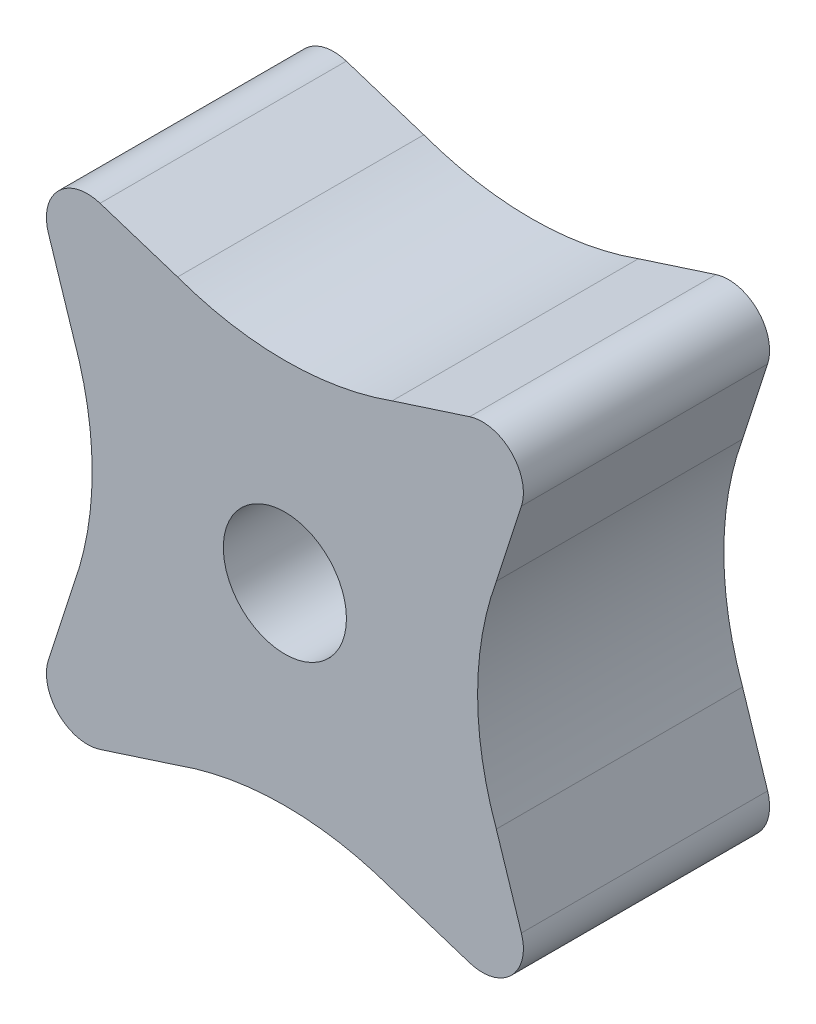
ISO-10303-21;
HEADER;
FILE_DESCRIPTION(('STEP AP214'),'2;1');
FILE_NAME('part.step','',(''),(''),'','','');
FILE_SCHEMA(('AUTOMOTIVE_DESIGN { 1 0 10303 214 1 1 1 1 }'));
ENDSEC;
DATA;
#1=APPLICATION_CONTEXT('core data for automotive mechanical design processes');
#2=APPLICATION_PROTOCOL_DEFINITION('international standard','automotive_design',2000,#1);
#3=PRODUCT_CONTEXT('',#1,'mechanical');
#4=PRODUCT('Part','Part','',(#3));
#5=PRODUCT_RELATED_PRODUCT_CATEGORY('part','',(#4));
#6=PRODUCT_DEFINITION_FORMATION('','',#4);
#7=PRODUCT_DEFINITION_CONTEXT('part definition',#1,'design');
#8=PRODUCT_DEFINITION('design','',#6,#7);
#9=PRODUCT_DEFINITION_SHAPE('','',#8);
#10=(LENGTH_UNIT() NAMED_UNIT(*) SI_UNIT(.MILLI.,.METRE.));
#11=(NAMED_UNIT(*) PLANE_ANGLE_UNIT() SI_UNIT($,.RADIAN.));
#12=(NAMED_UNIT(*) SI_UNIT($,.STERADIAN.) SOLID_ANGLE_UNIT());
#13=UNCERTAINTY_MEASURE_WITH_UNIT(LENGTH_MEASURE(1.E-05),#10,'distance_accuracy_value','');
#14=(GEOMETRIC_REPRESENTATION_CONTEXT(3) GLOBAL_UNCERTAINTY_ASSIGNED_CONTEXT((#13)) GLOBAL_UNIT_ASSIGNED_CONTEXT((#10,
#11,#12)) REPRESENTATION_CONTEXT('',''));
#15=CARTESIAN_POINT('',(0.,0.,0.));
#16=DIRECTION('',(0.,0.,1.));
#17=DIRECTION('',(1.,0.,0.));
#18=AXIS2_PLACEMENT_3D('',#15,#16,#17);
#19=CARTESIAN_POINT('',(-4.81138082412624,4.81138082412436,6.));
#20=DIRECTION('',(0.,0.,-1.));
#21=DIRECTION('',(-1.,0.,0.));
#22=AXIS2_PLACEMENT_3D('',#19,#20,#21);
#23=PLANE('',#22);
#24=CARTESIAN_POINT('',(-4.81138082412624,4.81138082412436,6.));
#25=DIRECTION('',(0.,0.,1.));
#26=DIRECTION('',(-1.,0.,0.));
#27=AXIS2_PLACEMENT_3D('',#24,#25,#26);
#28=CIRCLE('',#27,0.999999999999999);
#29=CARTESIAN_POINT('',(-4.50391183145184,5.76293892458054,6.));
#30=VERTEX_POINT('',#29);
#31=CARTESIAN_POINT('',(-5.7629389245828,4.50391183145111,6.));
#32=VERTEX_POINT('',#31);
#33=EDGE_CURVE('E208',#30,#32,#28,.T.);
#34=ORIENTED_EDGE('',*,*,#33,.T.);
#35=DIRECTION('',(0.307468992673234,-0.951558100456565,0.));
#36=VECTOR('',#35,1.);
#37=CARTESIAN_POINT('',(-5.15257063979893,2.61493798534649,6.));
#38=LINE('',#37,#36);
#39=CARTESIAN_POINT('',(-5.1525706397989,2.6149379853465,6.));
#40=VERTEX_POINT('',#39);
#41=EDGE_CURVE('E116',#32,#40,#38,.T.);
#42=ORIENTED_EDGE('',*,*,#41,.T.);
#43=CARTESIAN_POINT('',(-12.4148955874068,-6.95131414664462E-12,6.));
#44=DIRECTION('',(0.,0.,-1.));
#45=DIRECTION('',(1.,0.,0.));
#46=AXIS2_PLACEMENT_3D('',#43,#44,#45);
#47=CIRCLE('',#46,7.71876054246353);
#48=CARTESIAN_POINT('',(-5.15257063979467,-2.61493798534874,6.));
#49=VERTEX_POINT('',#48);
#50=EDGE_CURVE('E247',#40,#49,#47,.T.);
#51=ORIENTED_EDGE('',*,*,#50,.T.);
#52=DIRECTION('',(-0.307468992674399,-0.951558100456189,0.));
#53=VECTOR('',#52,1.);
#54=CARTESIAN_POINT('',(-5.76293892458059,-4.50391183145178,6.));
#55=LINE('',#54,#53);
#56=CARTESIAN_POINT('',(-5.76293892458059,-4.50391183145178,6.));
#57=VERTEX_POINT('',#56);
#58=EDGE_CURVE('E266',#49,#57,#55,.T.);
#59=ORIENTED_EDGE('',*,*,#58,.T.);
#60=CARTESIAN_POINT('',(-4.81138082412441,-4.81138082412619,6.));
#61=DIRECTION('',(0.,0.,1.));
#62=DIRECTION('',(-1.,0.,0.));
#63=AXIS2_PLACEMENT_3D('',#60,#61,#62);
#64=CIRCLE('',#63,0.999999999999999);
#65=CARTESIAN_POINT('',(-4.50391183145117,-5.76293892458276,6.));
#66=VERTEX_POINT('',#65);
#67=EDGE_CURVE('E263',#57,#66,#64,.T.);
#68=ORIENTED_EDGE('',*,*,#67,.T.);
#69=DIRECTION('',(0.951558100456568,0.307468992673224,0.));
#70=VECTOR('',#69,1.);
#71=CARTESIAN_POINT('',(-2.61493798534654,-5.1525706397989,6.));
#72=LINE('',#71,#70);
#73=CARTESIAN_POINT('',(-2.61493798534654,-5.1525706397989,6.));
#74=VERTEX_POINT('',#73);
#75=EDGE_CURVE('E265',#66,#74,#72,.T.);
#76=ORIENTED_EDGE('',*,*,#75,.T.);
#77=CARTESIAN_POINT('',(6.99379316117375E-12,-12.4148955874068,6.));
#78=DIRECTION('',(0.,0.,-1.));
#79=DIRECTION('',(1.,0.,0.));
#80=AXIS2_PLACEMENT_3D('',#77,#78,#79);
#81=CIRCLE('',#80,7.71876054246356);
#82=CARTESIAN_POINT('',(2.61493798534876,-5.15257063979467,6.));
#83=VERTEX_POINT('',#82);
#84=EDGE_CURVE('E268',#74,#83,#81,.T.);
#85=ORIENTED_EDGE('',*,*,#84,.T.);
#86=DIRECTION('',(0.95155810045619,-0.307468992674396,0.));
#87=VECTOR('',#86,1.);
#88=CARTESIAN_POINT('',(4.50391183145179,-5.76293892458057,6.));
#89=LINE('',#88,#87);
#90=CARTESIAN_POINT('',(4.5039118314518,-5.76293892458057,6.));
#91=VERTEX_POINT('',#90);
#92=EDGE_CURVE('E274',#83,#91,#89,.T.);
#93=ORIENTED_EDGE('',*,*,#92,.T.);
#94=CARTESIAN_POINT('',(4.81138082412621,-4.81138082412439,6.));
#95=DIRECTION('',(0.,0.,1.));
#96=DIRECTION('',(-1.,0.,0.));
#97=AXIS2_PLACEMENT_3D('',#94,#95,#96);
#98=CIRCLE('',#97,0.999999999999999);
#99=CARTESIAN_POINT('',(5.76293892458277,-4.50391183145115,6.));
#100=VERTEX_POINT('',#99);
#101=EDGE_CURVE('E276',#91,#100,#98,.T.);
#102=ORIENTED_EDGE('',*,*,#101,.T.);
#103=DIRECTION('',(-0.307468992673227,0.951558100456567,0.));
#104=VECTOR('',#103,1.);
#105=CARTESIAN_POINT('',(5.15257063979891,-2.61493798534652,6.));
#106=LINE('',#105,#104);
#107=CARTESIAN_POINT('',(5.15257063979891,-2.61493798534652,6.));
#108=VERTEX_POINT('',#107);
#109=EDGE_CURVE('E278',#100,#108,#106,.T.);
#110=ORIENTED_EDGE('',*,*,#109,.T.);
#111=CARTESIAN_POINT('',(12.4148955874068,7.03800689917885E-12,6.));
#112=DIRECTION('',(0.,0.,-1.));
#113=DIRECTION('',(1.,0.,0.));
#114=AXIS2_PLACEMENT_3D('',#111,#112,#113);
#115=CIRCLE('',#114,7.71876054246356);
#116=CARTESIAN_POINT('',(5.15257063979466,2.61493798534878,6.));
#117=VERTEX_POINT('',#116);
#118=EDGE_CURVE('E280',#108,#117,#115,.T.);
#119=ORIENTED_EDGE('',*,*,#118,.T.);
#120=DIRECTION('',(0.307468992674393,0.951558100456191,0.));
#121=VECTOR('',#120,1.);
#122=CARTESIAN_POINT('',(5.76293892458056,4.50391183145182,6.));
#123=LINE('',#122,#121);
#124=CARTESIAN_POINT('',(5.76293892458056,4.50391183145182,6.));
#125=VERTEX_POINT('',#124);
#126=EDGE_CURVE('E282',#117,#125,#123,.T.);
#127=ORIENTED_EDGE('',*,*,#126,.T.);
#128=CARTESIAN_POINT('',(4.81138082412437,4.81138082412623,6.));
#129=DIRECTION('',(0.,0.,1.));
#130=DIRECTION('',(-1.,0.,0.));
#131=AXIS2_PLACEMENT_3D('',#128,#129,#130);
#132=CIRCLE('',#131,0.999999999999999);
#133=CARTESIAN_POINT('',(4.50391183145113,5.76293892458279,6.));
#134=VERTEX_POINT('',#133);
#135=EDGE_CURVE('E159',#125,#134,#132,.T.);
#136=ORIENTED_EDGE('',*,*,#135,.T.);
#137=DIRECTION('',(-0.951558100456566,-0.307468992673231,0.));
#138=VECTOR('',#137,1.);
#139=CARTESIAN_POINT('',(2.6149379853465,5.15257063979892,6.));
#140=LINE('',#139,#138);
#141=CARTESIAN_POINT('',(2.6149379853465,5.15257063979892,6.));
#142=VERTEX_POINT('',#141);
#143=EDGE_CURVE('E153',#134,#142,#140,.T.);
#144=ORIENTED_EDGE('',*,*,#143,.T.);
#145=CARTESIAN_POINT('',(-7.08135327544597E-12,12.4148955874068,6.));
#146=DIRECTION('',(0.,0.,-1.));
#147=DIRECTION('',(1.,0.,0.));
#148=AXIS2_PLACEMENT_3D('',#145,#146,#147);
#149=CIRCLE('',#148,7.71876054246356);
#150=CARTESIAN_POINT('',(-2.6149379853488,5.15257063979465,6.));
#151=VERTEX_POINT('',#150);
#152=EDGE_CURVE('E157',#142,#151,#149,.T.);
#153=ORIENTED_EDGE('',*,*,#152,.T.);
#154=DIRECTION('',(-0.951558100456192,0.30746899267439,0.));
#155=VECTOR('',#154,1.);
#156=CARTESIAN_POINT('',(-4.50391183145184,5.76293892458054,6.));
#157=LINE('',#156,#155);
#158=EDGE_CURVE('E49',#151,#30,#157,.T.);
#159=ORIENTED_EDGE('',*,*,#158,.T.);
#160=EDGE_LOOP('',(#34,#42,#51,#59,#68,#76,#85,#93,#102,#110,#119,#127,#136,#144,#153,#159));
#161=FACE_BOUND('',#160,.T.);
#162=CARTESIAN_POINT('',(0.,0.,6.));
#163=DIRECTION('',(0.,0.,1.));
#164=DIRECTION('',(1.,0.,0.));
#165=AXIS2_PLACEMENT_3D('',#162,#163,#164);
#166=CIRCLE('',#165,1.5);
#167=CARTESIAN_POINT('',(1.5,0.,6.));
#168=VERTEX_POINT('',#167);
#169=EDGE_CURVE('E181',#168,#168,#166,.T.);
#170=ORIENTED_EDGE('',*,*,#169,.F.);
#171=EDGE_LOOP('',(#170));
#172=FACE_BOUND('',#171,.T.);
#173=ADVANCED_FACE('F32',(#161,#172),#23,.F.);
#174=CARTESIAN_POINT('',(-4.81138082412624,4.81138082412436,0.));
#175=DIRECTION('',(0.,0.,-1.));
#176=DIRECTION('',(-1.,0.,0.));
#177=AXIS2_PLACEMENT_3D('',#174,#175,#176);
#178=PLANE('',#177);
#179=CARTESIAN_POINT('',(-4.81138082412624,4.81138082412436,0.));
#180=DIRECTION('',(0.,0.,1.));
#181=DIRECTION('',(-1.,0.,0.));
#182=AXIS2_PLACEMENT_3D('',#179,#180,#181);
#183=CIRCLE('',#182,0.999999999999999);
#184=CARTESIAN_POINT('',(-4.50391183145184,5.76293892458054,0.));
#185=VERTEX_POINT('',#184);
#186=CARTESIAN_POINT('',(-5.7629389245828,4.50391183145111,0.));
#187=VERTEX_POINT('',#186);
#188=EDGE_CURVE('E177',#185,#187,#183,.T.);
#189=ORIENTED_EDGE('',*,*,#188,.F.);
#190=DIRECTION('',(-0.951558100456192,0.30746899267439,0.));
#191=VECTOR('',#190,1.);
#192=CARTESIAN_POINT('',(-4.50391183145184,5.76293892458054,0.));
#193=LINE('',#192,#191);
#194=CARTESIAN_POINT('',(-2.6149379853488,5.15257063979465,0.));
#195=VERTEX_POINT('',#194);
#196=EDGE_CURVE('E108',#195,#185,#193,.T.);
#197=ORIENTED_EDGE('',*,*,#196,.F.);
#198=CARTESIAN_POINT('',(-7.08135327544597E-12,12.4148955874068,0.));
#199=DIRECTION('',(0.,0.,-1.));
#200=DIRECTION('',(1.,0.,0.));
#201=AXIS2_PLACEMENT_3D('',#198,#199,#200);
#202=CIRCLE('',#201,7.71876054246356);
#203=CARTESIAN_POINT('',(2.6149379853465,5.15257063979892,0.));
#204=VERTEX_POINT('',#203);
#205=EDGE_CURVE('E102',#204,#195,#202,.T.);
#206=ORIENTED_EDGE('',*,*,#205,.F.);
#207=DIRECTION('',(-0.951558100456566,-0.307468992673231,0.));
#208=VECTOR('',#207,1.);
#209=CARTESIAN_POINT('',(2.6149379853465,5.15257063979892,0.));
#210=LINE('',#209,#208);
#211=CARTESIAN_POINT('',(4.50391183145113,5.76293892458279,0.));
#212=VERTEX_POINT('',#211);
#213=EDGE_CURVE('E167',#212,#204,#210,.T.);
#214=ORIENTED_EDGE('',*,*,#213,.F.);
#215=CARTESIAN_POINT('',(4.81138082412437,4.81138082412623,0.));
#216=DIRECTION('',(0.,0.,1.));
#217=DIRECTION('',(-1.,0.,0.));
#218=AXIS2_PLACEMENT_3D('',#215,#216,#217);
#219=CIRCLE('',#218,0.999999999999999);
#220=CARTESIAN_POINT('',(5.76293892458056,4.50391183145182,0.));
#221=VERTEX_POINT('',#220);
#222=EDGE_CURVE('E203',#221,#212,#219,.T.);
#223=ORIENTED_EDGE('',*,*,#222,.F.);
#224=DIRECTION('',(0.307468992674393,0.951558100456191,0.));
#225=VECTOR('',#224,1.);
#226=CARTESIAN_POINT('',(5.76293892458056,4.50391183145182,0.));
#227=LINE('',#226,#225);
#228=CARTESIAN_POINT('',(5.15257063979466,2.61493798534878,0.));
#229=VERTEX_POINT('',#228);
#230=EDGE_CURVE('E201',#229,#221,#227,.T.);
#231=ORIENTED_EDGE('',*,*,#230,.F.);
#232=CARTESIAN_POINT('',(12.4148955874068,7.03800689917885E-12,0.));
#233=DIRECTION('',(0.,0.,-1.));
#234=DIRECTION('',(1.,0.,0.));
#235=AXIS2_PLACEMENT_3D('',#232,#233,#234);
#236=CIRCLE('',#235,7.71876054246356);
#237=CARTESIAN_POINT('',(5.15257063979891,-2.61493798534652,0.));
#238=VERTEX_POINT('',#237);
#239=EDGE_CURVE('E199',#238,#229,#236,.T.);
#240=ORIENTED_EDGE('',*,*,#239,.F.);
#241=DIRECTION('',(-0.307468992673227,0.951558100456567,0.));
#242=VECTOR('',#241,1.);
#243=CARTESIAN_POINT('',(5.15257063979891,-2.61493798534652,0.));
#244=LINE('',#243,#242);
#245=CARTESIAN_POINT('',(5.76293892458277,-4.50391183145115,0.));
#246=VERTEX_POINT('',#245);
#247=EDGE_CURVE('E197',#246,#238,#244,.T.);
#248=ORIENTED_EDGE('',*,*,#247,.F.);
#249=CARTESIAN_POINT('',(4.81138082412621,-4.81138082412439,0.));
#250=DIRECTION('',(0.,0.,1.));
#251=DIRECTION('',(-1.,0.,0.));
#252=AXIS2_PLACEMENT_3D('',#249,#250,#251);
#253=CIRCLE('',#252,0.999999999999999);
#254=CARTESIAN_POINT('',(4.5039118314518,-5.76293892458057,0.));
#255=VERTEX_POINT('',#254);
#256=EDGE_CURVE('E195',#255,#246,#253,.T.);
#257=ORIENTED_EDGE('',*,*,#256,.F.);
#258=DIRECTION('',(0.95155810045619,-0.307468992674396,0.));
#259=VECTOR('',#258,1.);
#260=CARTESIAN_POINT('',(4.50391183145179,-5.76293892458057,0.));
#261=LINE('',#260,#259);
#262=CARTESIAN_POINT('',(2.61493798534876,-5.15257063979467,0.));
#263=VERTEX_POINT('',#262);
#264=EDGE_CURVE('E193',#263,#255,#261,.T.);
#265=ORIENTED_EDGE('',*,*,#264,.F.);
#266=CARTESIAN_POINT('',(6.99379316117375E-12,-12.4148955874068,0.));
#267=DIRECTION('',(0.,0.,-1.));
#268=DIRECTION('',(1.,0.,0.));
#269=AXIS2_PLACEMENT_3D('',#266,#267,#268);
#270=CIRCLE('',#269,7.71876054246356);
#271=CARTESIAN_POINT('',(-2.61493798534654,-5.1525706397989,0.));
#272=VERTEX_POINT('',#271);
#273=EDGE_CURVE('E191',#272,#263,#270,.T.);
#274=ORIENTED_EDGE('',*,*,#273,.F.);
#275=DIRECTION('',(0.951558100456568,0.307468992673224,0.));
#276=VECTOR('',#275,1.);
#277=CARTESIAN_POINT('',(-2.61493798534654,-5.1525706397989,0.));
#278=LINE('',#277,#276);
#279=CARTESIAN_POINT('',(-4.50391183145117,-5.76293892458276,0.));
#280=VERTEX_POINT('',#279);
#281=EDGE_CURVE('E189',#280,#272,#278,.T.);
#282=ORIENTED_EDGE('',*,*,#281,.F.);
#283=CARTESIAN_POINT('',(-4.81138082412441,-4.81138082412619,0.));
#284=DIRECTION('',(0.,0.,1.));
#285=DIRECTION('',(-1.,0.,0.));
#286=AXIS2_PLACEMENT_3D('',#283,#284,#285);
#287=CIRCLE('',#286,0.999999999999999);
#288=CARTESIAN_POINT('',(-5.76293892458059,-4.50391183145178,0.));
#289=VERTEX_POINT('',#288);
#290=EDGE_CURVE('E187',#289,#280,#287,.T.);
#291=ORIENTED_EDGE('',*,*,#290,.F.);
#292=DIRECTION('',(-0.307468992674399,-0.951558100456189,0.));
#293=VECTOR('',#292,1.);
#294=CARTESIAN_POINT('',(-5.76293892458059,-4.50391183145178,0.));
#295=LINE('',#294,#293);
#296=CARTESIAN_POINT('',(-5.15257063979467,-2.61493798534874,0.));
#297=VERTEX_POINT('',#296);
#298=EDGE_CURVE('E185',#297,#289,#295,.T.);
#299=ORIENTED_EDGE('',*,*,#298,.F.);
#300=CARTESIAN_POINT('',(-12.4148955874068,-6.95131414664462E-12,0.));
#301=DIRECTION('',(0.,0.,-1.));
#302=DIRECTION('',(1.,0.,0.));
#303=AXIS2_PLACEMENT_3D('',#300,#301,#302);
#304=CIRCLE('',#303,7.71876054246353);
#305=CARTESIAN_POINT('',(-5.1525706397989,2.6149379853465,0.));
#306=VERTEX_POINT('',#305);
#307=EDGE_CURVE('E183',#306,#297,#304,.T.);
#308=ORIENTED_EDGE('',*,*,#307,.F.);
#309=DIRECTION('',(0.307468992673234,-0.951558100456565,0.));
#310=VECTOR('',#309,1.);
#311=CARTESIAN_POINT('',(-5.15257063979893,2.61493798534649,0.));
#312=LINE('',#311,#310);
#313=EDGE_CURVE('E180',#187,#306,#312,.T.);
#314=ORIENTED_EDGE('',*,*,#313,.F.);
#315=EDGE_LOOP('',(#189,#197,#206,#214,#223,#231,#240,#248,#257,#265,#274,#282,#291,#299,#308,#314));
#316=FACE_BOUND('',#315,.T.);
#317=CARTESIAN_POINT('',(0.,0.,0.));
#318=DIRECTION('',(0.,0.,1.));
#319=DIRECTION('',(1.,0.,0.));
#320=AXIS2_PLACEMENT_3D('',#317,#318,#319);
#321=CIRCLE('',#320,1.5);
#322=CARTESIAN_POINT('',(1.5,0.,0.));
#323=VERTEX_POINT('',#322);
#324=EDGE_CURVE('E481',#323,#323,#321,.T.);
#325=ORIENTED_EDGE('',*,*,#324,.T.);
#326=EDGE_LOOP('',(#325));
#327=FACE_BOUND('',#326,.T.);
#328=ADVANCED_FACE('F251',(#316,#327),#178,.T.);
#329=CARTESIAN_POINT('',(-4.81138082412624,4.81138082412436,6.));
#330=DIRECTION('',(0.,0.,-1.));
#331=DIRECTION('',(-1.,0.,0.));
#332=AXIS2_PLACEMENT_3D('',#329,#330,#331);
#333=CYLINDRICAL_SURFACE('',#332,0.999999999999999);
#334=ORIENTED_EDGE('',*,*,#188,.T.);
#335=DIRECTION('',(0.,0.,-1.));
#336=VECTOR('',#335,1.);
#337=CARTESIAN_POINT('',(-5.7629389245828,4.50391183145111,6.));
#338=LINE('',#337,#336);
#339=EDGE_CURVE('E11',#32,#187,#338,.T.);
#340=ORIENTED_EDGE('',*,*,#339,.F.);
#341=ORIENTED_EDGE('',*,*,#33,.F.);
#342=DIRECTION('',(0.,0.,-1.));
#343=VECTOR('',#342,1.);
#344=CARTESIAN_POINT('',(-4.50391183145184,5.76293892458054,6.));
#345=LINE('',#344,#343);
#346=EDGE_CURVE('E173',#30,#185,#345,.T.);
#347=ORIENTED_EDGE('',*,*,#346,.T.);
#348=EDGE_LOOP('',(#334,#340,#341,#347));
#349=FACE_BOUND('',#348,.T.);
#350=ADVANCED_FACE('F34',(#349),#333,.T.);
#351=CARTESIAN_POINT('',(-5.15257063979893,2.61493798534649,6.));
#352=DIRECTION('',(0.951558100456565,0.307468992673234,0.));
#353=DIRECTION('',(-0.307468992673234,0.951558100456565,0.));
#354=AXIS2_PLACEMENT_3D('',#351,#352,#353);
#355=PLANE('',#354);
#356=ORIENTED_EDGE('',*,*,#313,.T.);
#357=DIRECTION('',(0.,0.,-1.));
#358=VECTOR('',#357,1.);
#359=CARTESIAN_POINT('',(-5.1525706397989,2.6149379853465,6.));
#360=LINE('',#359,#358);
#361=EDGE_CURVE('E41',#40,#306,#360,.T.);
#362=ORIENTED_EDGE('',*,*,#361,.F.);
#363=ORIENTED_EDGE('',*,*,#41,.F.);
#364=ORIENTED_EDGE('',*,*,#339,.T.);
#365=EDGE_LOOP('',(#356,#362,#363,#364));
#366=FACE_BOUND('',#365,.T.);
#367=ADVANCED_FACE('F316',(#366),#355,.F.);
#368=CARTESIAN_POINT('',(-12.4148955874068,-6.95131414664462E-12,6.));
#369=DIRECTION('',(0.,0.,-1.));
#370=DIRECTION('',(-1.,0.,0.));
#371=AXIS2_PLACEMENT_3D('',#368,#369,#370);
#372=CYLINDRICAL_SURFACE('',#371,7.71876054246353);
#373=ORIENTED_EDGE('',*,*,#307,.T.);
#374=DIRECTION('',(0.,0.,-1.));
#375=VECTOR('',#374,1.);
#376=CARTESIAN_POINT('',(-5.15257063979467,-2.61493798534874,6.));
#377=LINE('',#376,#375);
#378=EDGE_CURVE('E239',#49,#297,#377,.T.);
#379=ORIENTED_EDGE('',*,*,#378,.F.);
#380=ORIENTED_EDGE('',*,*,#50,.F.);
#381=ORIENTED_EDGE('',*,*,#361,.T.);
#382=EDGE_LOOP('',(#373,#379,#380,#381));
#383=FACE_BOUND('',#382,.T.);
#384=ADVANCED_FACE('F245',(#383),#372,.F.);
#385=CARTESIAN_POINT('',(-5.76293892458059,-4.50391183145178,6.));
#386=DIRECTION('',(0.951558100456189,-0.307468992674399,0.));
#387=DIRECTION('',(0.307468992674399,0.951558100456189,0.));
#388=AXIS2_PLACEMENT_3D('',#385,#386,#387);
#389=PLANE('',#388);
#390=ORIENTED_EDGE('',*,*,#298,.T.);
#391=DIRECTION('',(0.,0.,-1.));
#392=VECTOR('',#391,1.);
#393=CARTESIAN_POINT('',(-5.76293892458059,-4.50391183145178,6.));
#394=LINE('',#393,#392);
#395=EDGE_CURVE('E236',#57,#289,#394,.T.);
#396=ORIENTED_EDGE('',*,*,#395,.F.);
#397=ORIENTED_EDGE('',*,*,#58,.F.);
#398=ORIENTED_EDGE('',*,*,#378,.T.);
#399=EDGE_LOOP('',(#390,#396,#397,#398));
#400=FACE_BOUND('',#399,.T.);
#401=ADVANCED_FACE('F257',(#400),#389,.F.);
#402=CARTESIAN_POINT('',(-4.81138082412441,-4.81138082412619,6.));
#403=DIRECTION('',(0.,0.,-1.));
#404=DIRECTION('',(-1.,0.,0.));
#405=AXIS2_PLACEMENT_3D('',#402,#403,#404);
#406=CYLINDRICAL_SURFACE('',#405,0.999999999999999);
#407=ORIENTED_EDGE('',*,*,#290,.T.);
#408=DIRECTION('',(0.,0.,-1.));
#409=VECTOR('',#408,1.);
#410=CARTESIAN_POINT('',(-4.50391183145117,-5.76293892458276,6.));
#411=LINE('',#410,#409);
#412=EDGE_CURVE('E233',#66,#280,#411,.T.);
#413=ORIENTED_EDGE('',*,*,#412,.F.);
#414=ORIENTED_EDGE('',*,*,#67,.F.);
#415=ORIENTED_EDGE('',*,*,#395,.T.);
#416=EDGE_LOOP('',(#407,#413,#414,#415));
#417=FACE_BOUND('',#416,.T.);
#418=ADVANCED_FACE('F261',(#417),#406,.T.);
#419=CARTESIAN_POINT('',(-2.61493798534654,-5.1525706397989,6.));
#420=DIRECTION('',(-0.307468992673224,0.951558100456568,0.));
#421=DIRECTION('',(-0.951558100456569,-0.307468992673224,0.));
#422=AXIS2_PLACEMENT_3D('',#419,#420,#421);
#423=PLANE('',#422);
#424=ORIENTED_EDGE('',*,*,#281,.T.);
#425=DIRECTION('',(0.,0.,-1.));
#426=VECTOR('',#425,1.);
#427=CARTESIAN_POINT('',(-2.61493798534654,-5.1525706397989,6.));
#428=LINE('',#427,#426);
#429=EDGE_CURVE('E230',#74,#272,#428,.T.);
#430=ORIENTED_EDGE('',*,*,#429,.F.);
#431=ORIENTED_EDGE('',*,*,#75,.F.);
#432=ORIENTED_EDGE('',*,*,#412,.T.);
#433=EDGE_LOOP('',(#424,#430,#431,#432));
#434=FACE_BOUND('',#433,.T.);
#435=ADVANCED_FACE('F329',(#434),#423,.F.);
#436=CARTESIAN_POINT('',(6.99379316117375E-12,-12.4148955874068,6.));
#437=DIRECTION('',(0.,0.,-1.));
#438=DIRECTION('',(-1.,0.,0.));
#439=AXIS2_PLACEMENT_3D('',#436,#437,#438);
#440=CYLINDRICAL_SURFACE('',#439,7.71876054246356);
#441=ORIENTED_EDGE('',*,*,#273,.T.);
#442=DIRECTION('',(0.,0.,-1.));
#443=VECTOR('',#442,1.);
#444=CARTESIAN_POINT('',(2.61493798534876,-5.15257063979467,6.));
#445=LINE('',#444,#443);
#446=EDGE_CURVE('E227',#83,#263,#445,.T.);
#447=ORIENTED_EDGE('',*,*,#446,.F.);
#448=ORIENTED_EDGE('',*,*,#84,.F.);
#449=ORIENTED_EDGE('',*,*,#429,.T.);
#450=EDGE_LOOP('',(#441,#447,#448,#449));
#451=FACE_BOUND('',#450,.T.);
#452=ADVANCED_FACE('F332',(#451),#440,.F.);
#453=CARTESIAN_POINT('',(4.50391183145179,-5.76293892458057,6.));
#454=DIRECTION('',(0.307468992674396,0.95155810045619,0.));
#455=DIRECTION('',(-0.95155810045619,0.307468992674396,0.));
#456=AXIS2_PLACEMENT_3D('',#453,#454,#455);
#457=PLANE('',#456);
#458=ORIENTED_EDGE('',*,*,#264,.T.);
#459=DIRECTION('',(0.,0.,-1.));
#460=VECTOR('',#459,1.);
#461=CARTESIAN_POINT('',(4.5039118314518,-5.76293892458057,6.));
#462=LINE('',#461,#460);
#463=EDGE_CURVE('E224',#91,#255,#462,.T.);
#464=ORIENTED_EDGE('',*,*,#463,.F.);
#465=ORIENTED_EDGE('',*,*,#92,.F.);
#466=ORIENTED_EDGE('',*,*,#446,.T.);
#467=EDGE_LOOP('',(#458,#464,#465,#466));
#468=FACE_BOUND('',#467,.T.);
#469=ADVANCED_FACE('F336',(#468),#457,.F.);
#470=CARTESIAN_POINT('',(4.81138082412621,-4.81138082412439,6.));
#471=DIRECTION('',(0.,0.,-1.));
#472=DIRECTION('',(-1.,0.,0.));
#473=AXIS2_PLACEMENT_3D('',#470,#471,#472);
#474=CYLINDRICAL_SURFACE('',#473,0.999999999999999);
#475=ORIENTED_EDGE('',*,*,#256,.T.);
#476=DIRECTION('',(0.,0.,-1.));
#477=VECTOR('',#476,1.);
#478=CARTESIAN_POINT('',(5.76293892458277,-4.50391183145115,6.));
#479=LINE('',#478,#477);
#480=EDGE_CURVE('E221',#100,#246,#479,.T.);
#481=ORIENTED_EDGE('',*,*,#480,.F.);
#482=ORIENTED_EDGE('',*,*,#101,.F.);
#483=ORIENTED_EDGE('',*,*,#463,.T.);
#484=EDGE_LOOP('',(#475,#481,#482,#483));
#485=FACE_BOUND('',#484,.T.);
#486=ADVANCED_FACE('F340',(#485),#474,.T.);
#487=CARTESIAN_POINT('',(5.15257063979891,-2.61493798534652,6.));
#488=DIRECTION('',(-0.951558100456567,-0.307468992673227,0.));
#489=DIRECTION('',(0.307468992673227,-0.951558100456567,0.));
#490=AXIS2_PLACEMENT_3D('',#487,#488,#489);
#491=PLANE('',#490);
#492=ORIENTED_EDGE('',*,*,#247,.T.);
#493=DIRECTION('',(0.,0.,-1.));
#494=VECTOR('',#493,1.);
#495=CARTESIAN_POINT('',(5.15257063979891,-2.61493798534652,6.));
#496=LINE('',#495,#494);
#497=EDGE_CURVE('E218',#108,#238,#496,.T.);
#498=ORIENTED_EDGE('',*,*,#497,.F.);
#499=ORIENTED_EDGE('',*,*,#109,.F.);
#500=ORIENTED_EDGE('',*,*,#480,.T.);
#501=EDGE_LOOP('',(#492,#498,#499,#500));
#502=FACE_BOUND('',#501,.T.);
#503=ADVANCED_FACE('F344',(#502),#491,.F.);
#504=CARTESIAN_POINT('',(12.4148955874068,7.03800689917885E-12,6.));
#505=DIRECTION('',(0.,0.,-1.));
#506=DIRECTION('',(-1.,0.,0.));
#507=AXIS2_PLACEMENT_3D('',#504,#505,#506);
#508=CYLINDRICAL_SURFACE('',#507,7.71876054246356);
#509=ORIENTED_EDGE('',*,*,#239,.T.);
#510=DIRECTION('',(0.,0.,-1.));
#511=VECTOR('',#510,1.);
#512=CARTESIAN_POINT('',(5.15257063979466,2.61493798534878,6.));
#513=LINE('',#512,#511);
#514=EDGE_CURVE('E215',#117,#229,#513,.T.);
#515=ORIENTED_EDGE('',*,*,#514,.F.);
#516=ORIENTED_EDGE('',*,*,#118,.F.);
#517=ORIENTED_EDGE('',*,*,#497,.T.);
#518=EDGE_LOOP('',(#509,#515,#516,#517));
#519=FACE_BOUND('',#518,.T.);
#520=ADVANCED_FACE('F348',(#519),#508,.F.);
#521=CARTESIAN_POINT('',(5.76293892458056,4.50391183145182,6.));
#522=DIRECTION('',(-0.951558100456191,0.307468992674393,0.));
#523=DIRECTION('',(-0.307468992674393,-0.951558100456191,0.));
#524=AXIS2_PLACEMENT_3D('',#521,#522,#523);
#525=PLANE('',#524);
#526=ORIENTED_EDGE('',*,*,#230,.T.);
#527=DIRECTION('',(0.,0.,-1.));
#528=VECTOR('',#527,1.);
#529=CARTESIAN_POINT('',(5.76293892458056,4.50391183145182,6.));
#530=LINE('',#529,#528);
#531=EDGE_CURVE('E212',#125,#221,#530,.T.);
#532=ORIENTED_EDGE('',*,*,#531,.F.);
#533=ORIENTED_EDGE('',*,*,#126,.F.);
#534=ORIENTED_EDGE('',*,*,#514,.T.);
#535=EDGE_LOOP('',(#526,#532,#533,#534));
#536=FACE_BOUND('',#535,.T.);
#537=ADVANCED_FACE('F288',(#536),#525,.F.);
#538=CARTESIAN_POINT('',(4.81138082412437,4.81138082412623,6.));
#539=DIRECTION('',(0.,0.,-1.));
#540=DIRECTION('',(-1.,0.,0.));
#541=AXIS2_PLACEMENT_3D('',#538,#539,#540);
#542=CYLINDRICAL_SURFACE('',#541,0.999999999999999);
#543=ORIENTED_EDGE('',*,*,#222,.T.);
#544=DIRECTION('',(0.,0.,-1.));
#545=VECTOR('',#544,1.);
#546=CARTESIAN_POINT('',(4.50391183145113,5.76293892458279,6.));
#547=LINE('',#546,#545);
#548=EDGE_CURVE('E168',#134,#212,#547,.T.);
#549=ORIENTED_EDGE('',*,*,#548,.F.);
#550=ORIENTED_EDGE('',*,*,#135,.F.);
#551=ORIENTED_EDGE('',*,*,#531,.T.);
#552=EDGE_LOOP('',(#543,#549,#550,#551));
#553=FACE_BOUND('',#552,.T.);
#554=ADVANCED_FACE('F292',(#553),#542,.T.);
#555=CARTESIAN_POINT('',(2.6149379853465,5.15257063979892,6.));
#556=DIRECTION('',(0.307468992673231,-0.951558100456566,0.));
#557=DIRECTION('',(0.951558100456566,0.307468992673231,0.));
#558=AXIS2_PLACEMENT_3D('',#555,#556,#557);
#559=PLANE('',#558);
#560=ORIENTED_EDGE('',*,*,#213,.T.);
#561=DIRECTION('',(0.,0.,-1.));
#562=VECTOR('',#561,1.);
#563=CARTESIAN_POINT('',(2.6149379853465,5.15257063979892,6.));
#564=LINE('',#563,#562);
#565=EDGE_CURVE('E164',#142,#204,#564,.T.);
#566=ORIENTED_EDGE('',*,*,#565,.F.);
#567=ORIENTED_EDGE('',*,*,#143,.F.);
#568=ORIENTED_EDGE('',*,*,#548,.T.);
#569=EDGE_LOOP('',(#560,#566,#567,#568));
#570=FACE_BOUND('',#569,.T.);
#571=ADVANCED_FACE('F165',(#570),#559,.F.);
#572=CARTESIAN_POINT('',(-7.08135327544597E-12,12.4148955874068,6.));
#573=DIRECTION('',(0.,0.,-1.));
#574=DIRECTION('',(-1.,0.,0.));
#575=AXIS2_PLACEMENT_3D('',#572,#573,#574);
#576=CYLINDRICAL_SURFACE('',#575,7.71876054246356);
#577=ORIENTED_EDGE('',*,*,#205,.T.);
#578=DIRECTION('',(0.,0.,-1.));
#579=VECTOR('',#578,1.);
#580=CARTESIAN_POINT('',(-2.6149379853488,5.15257063979465,6.));
#581=LINE('',#580,#579);
#582=EDGE_CURVE('E169',#151,#195,#581,.T.);
#583=ORIENTED_EDGE('',*,*,#582,.F.);
#584=ORIENTED_EDGE('',*,*,#152,.F.);
#585=ORIENTED_EDGE('',*,*,#565,.T.);
#586=EDGE_LOOP('',(#577,#583,#584,#585));
#587=FACE_BOUND('',#586,.T.);
#588=ADVANCED_FACE('F171',(#587),#576,.F.);
#589=CARTESIAN_POINT('',(-4.50391183145184,5.76293892458054,6.));
#590=DIRECTION('',(-0.30746899267439,-0.951558100456192,0.));
#591=DIRECTION('',(0.951558100456192,-0.30746899267439,0.));
#592=AXIS2_PLACEMENT_3D('',#589,#590,#591);
#593=PLANE('',#592);
#594=ORIENTED_EDGE('',*,*,#196,.T.);
#595=ORIENTED_EDGE('',*,*,#346,.F.);
#596=ORIENTED_EDGE('',*,*,#158,.F.);
#597=ORIENTED_EDGE('',*,*,#582,.T.);
#598=EDGE_LOOP('',(#594,#595,#596,#597));
#599=FACE_BOUND('',#598,.T.);
#600=ADVANCED_FACE('F296',(#599),#593,.F.);
#601=CARTESIAN_POINT('',(0.,0.,6.));
#602=DIRECTION('',(0.,0.,-1.));
#603=DIRECTION('',(-1.,0.,0.));
#604=AXIS2_PLACEMENT_3D('',#601,#602,#603);
#605=CYLINDRICAL_SURFACE('',#604,1.5);
#606=ORIENTED_EDGE('',*,*,#169,.T.);
#607=EDGE_LOOP('',(#606));
#608=FACE_BOUND('',#607,.T.);
#609=ORIENTED_EDGE('',*,*,#324,.F.);
#610=EDGE_LOOP('',(#609));
#611=FACE_BOUND('',#610,.T.);
#612=ADVANCED_FACE('F298',(#608,#611),#605,.F.);
#613=CLOSED_SHELL('',(#173,#328,#350,#367,#384,#401,#418,#435,#452,#469,#486,#503,#520,#537,
#554,#571,#588,#600,#612));
#614=MANIFOLD_SOLID_BREP('B2',#613);
#615=ADVANCED_BREP_SHAPE_REPRESENTATION('',(#18,#614),#14);
#616=SHAPE_DEFINITION_REPRESENTATION(#9,#615);
ENDSEC;
END-ISO-10303-21;
